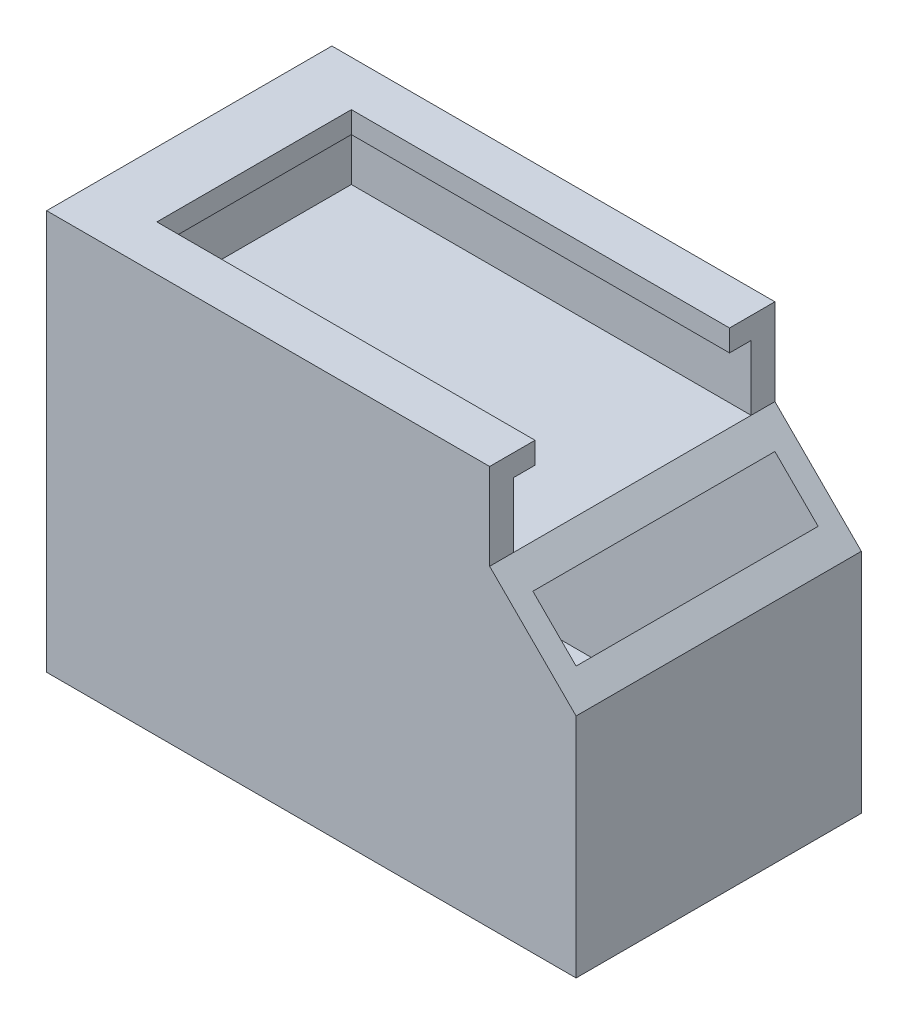
ISO-10303-21;
HEADER;
FILE_DESCRIPTION(('STEP AP214'),'2;1');
FILE_NAME('part.step','',(''),(''),'','','');
FILE_SCHEMA(('AUTOMOTIVE_DESIGN { 1 0 10303 214 1 1 1 1 }'));
ENDSEC;
DATA;
#1=APPLICATION_CONTEXT('core data for automotive mechanical design processes');
#2=APPLICATION_PROTOCOL_DEFINITION('international standard','automotive_design',2000,#1);
#3=PRODUCT_CONTEXT('',#1,'mechanical');
#4=PRODUCT('Part','Part','',(#3));
#5=PRODUCT_RELATED_PRODUCT_CATEGORY('part','',(#4));
#6=PRODUCT_DEFINITION_FORMATION('','',#4);
#7=PRODUCT_DEFINITION_CONTEXT('part definition',#1,'design');
#8=PRODUCT_DEFINITION('design','',#6,#7);
#9=PRODUCT_DEFINITION_SHAPE('','',#8);
#10=(LENGTH_UNIT() NAMED_UNIT(*) SI_UNIT(.MILLI.,.METRE.));
#11=(NAMED_UNIT(*) PLANE_ANGLE_UNIT() SI_UNIT($,.RADIAN.));
#12=(NAMED_UNIT(*) SI_UNIT($,.STERADIAN.) SOLID_ANGLE_UNIT());
#13=UNCERTAINTY_MEASURE_WITH_UNIT(LENGTH_MEASURE(1.E-05),#10,'distance_accuracy_value','');
#14=(GEOMETRIC_REPRESENTATION_CONTEXT(3) GLOBAL_UNCERTAINTY_ASSIGNED_CONTEXT((#13)) GLOBAL_UNIT_ASSIGNED_CONTEXT((#10,
#11,#12)) REPRESENTATION_CONTEXT('',''));
#15=CARTESIAN_POINT('',(0.,0.,0.));
#16=DIRECTION('',(0.,0.,1.));
#17=DIRECTION('',(1.,0.,0.));
#18=AXIS2_PLACEMENT_3D('',#15,#16,#17);
#19=CARTESIAN_POINT('',(0.,34.29,28.448));
#20=DIRECTION('',(0.,-1.,0.));
#21=DIRECTION('',(0.,0.,-1.));
#22=AXIS2_PLACEMENT_3D('',#19,#20,#21);
#23=PLANE('',#22);
#24=DIRECTION('',(-1.,0.,0.));
#25=VECTOR('',#24,1.);
#26=CARTESIAN_POINT('',(49.53,34.29,28.194));
#27=LINE('',#26,#25);
#28=CARTESIAN_POINT('',(49.53,34.29,28.194));
#29=VERTEX_POINT('',#28);
#30=CARTESIAN_POINT('',(2.54,34.29,28.194));
#31=VERTEX_POINT('',#30);
#32=EDGE_CURVE('E56',#29,#31,#27,.T.);
#33=ORIENTED_EDGE('',*,*,#32,.F.);
#34=DIRECTION('',(0.,0.,1.));
#35=VECTOR('',#34,1.);
#36=CARTESIAN_POINT('',(49.53,34.29,-2.54));
#37=LINE('',#36,#35);
#38=CARTESIAN_POINT('',(49.53,34.29,0.253999999999999));
#39=VERTEX_POINT('',#38);
#40=EDGE_CURVE('E311',#39,#29,#37,.T.);
#41=ORIENTED_EDGE('',*,*,#40,.F.);
#42=DIRECTION('',(1.,0.,0.));
#43=VECTOR('',#42,1.);
#44=CARTESIAN_POINT('',(2.54,34.29,0.254000000000001));
#45=LINE('',#44,#43);
#46=CARTESIAN_POINT('',(2.54,34.29,0.254000000000001));
#47=VERTEX_POINT('',#46);
#48=EDGE_CURVE('E554',#47,#39,#45,.T.);
#49=ORIENTED_EDGE('',*,*,#48,.F.);
#50=DIRECTION('',(0.,0.,-1.));
#51=VECTOR('',#50,1.);
#52=CARTESIAN_POINT('',(2.54,34.29,28.194));
#53=LINE('',#52,#51);
#54=EDGE_CURVE('E51',#31,#47,#53,.T.);
#55=ORIENTED_EDGE('',*,*,#54,.F.);
#56=EDGE_LOOP('',(#33,#41,#49,#55));
#57=FACE_BOUND('',#56,.T.);
#58=ADVANCED_FACE('F34',(#57),#23,.F.);
#59=CARTESIAN_POINT('',(0.,0.,28.448));
#60=DIRECTION('',(1.,0.,0.));
#61=DIRECTION('',(0.,0.,-1.));
#62=AXIS2_PLACEMENT_3D('',#59,#60,#61);
#63=PLANE('',#62);
#64=DIRECTION('',(0.,-1.,0.));
#65=VECTOR('',#64,1.);
#66=CARTESIAN_POINT('',(0.,0.,0.));
#67=LINE('',#66,#65);
#68=CARTESIAN_POINT('',(0.,31.75,0.));
#69=VERTEX_POINT('',#68);
#70=CARTESIAN_POINT('',(0.,0.,0.));
#71=VERTEX_POINT('',#70);
#72=EDGE_CURVE('E270',#69,#71,#67,.T.);
#73=ORIENTED_EDGE('',*,*,#72,.F.);
#74=DIRECTION('',(0.,0.,-1.));
#75=VECTOR('',#74,1.);
#76=CARTESIAN_POINT('',(0.,31.75,28.448));
#77=LINE('',#76,#75);
#78=CARTESIAN_POINT('',(0.,31.75,28.448));
#79=VERTEX_POINT('',#78);
#80=EDGE_CURVE('E306',#79,#69,#77,.T.);
#81=ORIENTED_EDGE('',*,*,#80,.F.);
#82=DIRECTION('',(0.,-1.,0.));
#83=VECTOR('',#82,1.);
#84=CARTESIAN_POINT('',(0.,0.,28.448));
#85=LINE('',#84,#83);
#86=CARTESIAN_POINT('',(0.,0.,28.448));
#87=VERTEX_POINT('',#86);
#88=EDGE_CURVE('E290',#79,#87,#85,.T.);
#89=ORIENTED_EDGE('',*,*,#88,.T.);
#90=DIRECTION('',(0.,0.,-1.));
#91=VECTOR('',#90,1.);
#92=CARTESIAN_POINT('',(0.,0.,28.448));
#93=LINE('',#92,#91);
#94=EDGE_CURVE('E301',#87,#71,#93,.T.);
#95=ORIENTED_EDGE('',*,*,#94,.T.);
#96=EDGE_LOOP('',(#73,#81,#89,#95));
#97=FACE_BOUND('',#96,.T.);
#98=ADVANCED_FACE('F345',(#97),#63,.T.);
#99=CARTESIAN_POINT('',(0.,0.,28.448));
#100=DIRECTION('',(0.,1.,0.));
#101=DIRECTION('',(0.,0.,1.));
#102=AXIS2_PLACEMENT_3D('',#99,#100,#101);
#103=PLANE('',#102);
#104=DIRECTION('',(1.,0.,0.));
#105=VECTOR('',#104,1.);
#106=CARTESIAN_POINT('',(0.,0.,0.));
#107=LINE('',#106,#105);
#108=CARTESIAN_POINT('',(57.15,0.,0.));
#109=VERTEX_POINT('',#108);
#110=EDGE_CURVE('E304',#71,#109,#107,.T.);
#111=ORIENTED_EDGE('',*,*,#110,.F.);
#112=ORIENTED_EDGE('',*,*,#94,.F.);
#113=DIRECTION('',(1.,0.,0.));
#114=VECTOR('',#113,1.);
#115=CARTESIAN_POINT('',(0.,0.,28.448));
#116=LINE('',#115,#114);
#117=CARTESIAN_POINT('',(57.15,0.,28.448));
#118=VERTEX_POINT('',#117);
#119=EDGE_CURVE('E288',#87,#118,#116,.T.);
#120=ORIENTED_EDGE('',*,*,#119,.T.);
#121=DIRECTION('',(0.,0.,-1.));
#122=VECTOR('',#121,1.);
#123=CARTESIAN_POINT('',(57.15,0.,28.448));
#124=LINE('',#123,#122);
#125=EDGE_CURVE('E295',#118,#109,#124,.T.);
#126=ORIENTED_EDGE('',*,*,#125,.T.);
#127=EDGE_LOOP('',(#111,#112,#120,#126));
#128=FACE_BOUND('',#127,.T.);
#129=ADVANCED_FACE('F340',(#128),#103,.T.);
#130=CARTESIAN_POINT('',(57.15,0.,28.448));
#131=DIRECTION('',(-1.,0.,0.));
#132=DIRECTION('',(0.,0.,1.));
#133=AXIS2_PLACEMENT_3D('',#130,#131,#132);
#134=PLANE('',#133);
#135=DIRECTION('',(0.,0.,1.));
#136=VECTOR('',#135,1.);
#137=CARTESIAN_POINT('',(57.15,26.6700000000001,28.448));
#138=LINE('',#137,#136);
#139=CARTESIAN_POINT('',(57.15,26.6700000000001,0.));
#140=VERTEX_POINT('',#139);
#141=CARTESIAN_POINT('',(57.15,26.6700000000001,28.448));
#142=VERTEX_POINT('',#141);
#143=EDGE_CURVE('E264',#140,#142,#138,.T.);
#144=ORIENTED_EDGE('',*,*,#143,.F.);
#145=DIRECTION('',(0.,1.,0.));
#146=VECTOR('',#145,1.);
#147=CARTESIAN_POINT('',(57.15,0.,0.));
#148=LINE('',#147,#146);
#149=EDGE_CURVE('E298',#109,#140,#148,.T.);
#150=ORIENTED_EDGE('',*,*,#149,.F.);
#151=ORIENTED_EDGE('',*,*,#125,.F.);
#152=DIRECTION('',(0.,1.,0.));
#153=VECTOR('',#152,1.);
#154=CARTESIAN_POINT('',(57.15,0.,28.448));
#155=LINE('',#154,#153);
#156=EDGE_CURVE('E285',#118,#142,#155,.T.);
#157=ORIENTED_EDGE('',*,*,#156,.T.);
#158=EDGE_LOOP('',(#144,#150,#151,#157));
#159=FACE_BOUND('',#158,.T.);
#160=ADVANCED_FACE('F338',(#159),#134,.T.);
#161=CARTESIAN_POINT('',(0.,31.75,28.448));
#162=DIRECTION('',(0.,-1.,0.));
#163=DIRECTION('',(0.,0.,-1.));
#164=AXIS2_PLACEMENT_3D('',#161,#162,#163);
#165=PLANE('',#164);
#166=DIRECTION('',(0.,0.,-1.));
#167=VECTOR('',#166,1.);
#168=CARTESIAN_POINT('',(52.07,31.75,28.448));
#169=LINE('',#168,#167);
#170=CARTESIAN_POINT('',(52.07,31.75,28.448));
#171=VERTEX_POINT('',#170);
#172=CARTESIAN_POINT('',(52.07,31.75,0.));
#173=VERTEX_POINT('',#172);
#174=EDGE_CURVE('E322',#171,#173,#169,.T.);
#175=ORIENTED_EDGE('',*,*,#174,.F.);
#176=DIRECTION('',(-1.,0.,0.));
#177=VECTOR('',#176,1.);
#178=CARTESIAN_POINT('',(0.,31.75,28.448));
#179=LINE('',#178,#177);
#180=EDGE_CURVE('E43',#171,#79,#179,.T.);
#181=ORIENTED_EDGE('',*,*,#180,.T.);
#182=ORIENTED_EDGE('',*,*,#80,.T.);
#183=DIRECTION('',(-1.,0.,0.));
#184=VECTOR('',#183,1.);
#185=CARTESIAN_POINT('',(0.,31.75,0.));
#186=LINE('',#185,#184);
#187=EDGE_CURVE('E293',#173,#69,#186,.T.);
#188=ORIENTED_EDGE('',*,*,#187,.F.);
#189=EDGE_LOOP('',(#175,#181,#182,#188));
#190=FACE_BOUND('',#189,.T.);
#191=ADVANCED_FACE('F348',(#190),#165,.T.);
#192=CARTESIAN_POINT('',(0.,0.,28.448));
#193=DIRECTION('',(0.,0.,-1.));
#194=DIRECTION('',(-1.,0.,0.));
#195=AXIS2_PLACEMENT_3D('',#192,#193,#194);
#196=PLANE('',#195);
#197=DIRECTION('',(-0.707106781186551,0.707106781186544,0.));
#198=VECTOR('',#197,1.);
#199=CARTESIAN_POINT('',(41.9099999999998,41.9100000000002,28.448));
#200=LINE('',#199,#198);
#201=EDGE_CURVE('E260',#142,#171,#200,.T.);
#202=ORIENTED_EDGE('',*,*,#201,.F.);
#203=ORIENTED_EDGE('',*,*,#156,.F.);
#204=ORIENTED_EDGE('',*,*,#119,.F.);
#205=ORIENTED_EDGE('',*,*,#88,.F.);
#206=ORIENTED_EDGE('',*,*,#180,.F.);
#207=EDGE_LOOP('',(#202,#203,#204,#205,#206));
#208=FACE_BOUND('',#207,.T.);
#209=ADVANCED_FACE('F335',(#208),#196,.T.);
#210=CARTESIAN_POINT('',(0.,0.,0.));
#211=DIRECTION('',(0.,0.,-1.));
#212=DIRECTION('',(-1.,0.,0.));
#213=AXIS2_PLACEMENT_3D('',#210,#211,#212);
#214=PLANE('',#213);
#215=ORIENTED_EDGE('',*,*,#149,.T.);
#216=DIRECTION('',(-0.707106781186551,0.707106781186544,0.));
#217=VECTOR('',#216,1.);
#218=CARTESIAN_POINT('',(41.9099999999998,41.9100000000002,0.));
#219=LINE('',#218,#217);
#220=EDGE_CURVE('E11',#140,#173,#219,.T.);
#221=ORIENTED_EDGE('',*,*,#220,.T.);
#222=ORIENTED_EDGE('',*,*,#187,.T.);
#223=ORIENTED_EDGE('',*,*,#72,.T.);
#224=ORIENTED_EDGE('',*,*,#110,.T.);
#225=EDGE_LOOP('',(#215,#221,#222,#223,#224));
#226=FACE_BOUND('',#225,.T.);
#227=ADVANCED_FACE('F36',(#226),#214,.F.);
#228=CARTESIAN_POINT('',(49.53,34.29,-2.54));
#229=DIRECTION('',(-0.707106781186544,-0.707106781186551,0.));
#230=DIRECTION('',(0.707106781186551,-0.707106781186544,0.));
#231=AXIS2_PLACEMENT_3D('',#228,#229,#230);
#232=PLANE('',#231);
#233=ORIENTED_EDGE('',*,*,#201,.T.);
#234=ORIENTED_EDGE('',*,*,#174,.T.);
#235=ORIENTED_EDGE('',*,*,#220,.F.);
#236=ORIENTED_EDGE('',*,*,#143,.T.);
#237=EDGE_LOOP('',(#233,#234,#235,#236));
#238=FACE_BOUND('',#237,.T.);
#239=DIRECTION('',(0.,0.,1.));
#240=VECTOR('',#239,1.);
#241=CARTESIAN_POINT('',(59.69,24.1300000000001,-2.54));
#242=LINE('',#241,#240);
#243=CARTESIAN_POINT('',(59.69,24.1300000000001,-2.54));
#244=VERTEX_POINT('',#243);
#245=CARTESIAN_POINT('',(59.69,24.1300000000001,30.988));
#246=VERTEX_POINT('',#245);
#247=EDGE_CURVE('E320',#244,#246,#242,.T.);
#248=ORIENTED_EDGE('',*,*,#247,.F.);
#249=DIRECTION('',(0.707106781186551,-0.707106781186544,0.));
#250=VECTOR('',#249,1.);
#251=CARTESIAN_POINT('',(49.53,34.29,-2.54));
#252=LINE('',#251,#250);
#253=CARTESIAN_POINT('',(49.53,34.29,-2.54));
#254=VERTEX_POINT('',#253);
#255=EDGE_CURVE('E315',#254,#244,#252,.T.);
#256=ORIENTED_EDGE('',*,*,#255,.F.);
#257=EDGE_CURVE('E314',#254,#39,#37,.T.);
#258=ORIENTED_EDGE('',*,*,#257,.T.);
#259=ORIENTED_EDGE('',*,*,#40,.T.);
#260=DIRECTION('',(0.,0.,1.));
#261=VECTOR('',#260,1.);
#262=CARTESIAN_POINT('',(49.53,34.29,28.194));
#263=LINE('',#262,#261);
#264=CARTESIAN_POINT('',(49.53,34.29,30.988));
#265=VERTEX_POINT('',#264);
#266=EDGE_CURVE('E558',#29,#265,#263,.T.);
#267=ORIENTED_EDGE('',*,*,#266,.T.);
#268=DIRECTION('',(0.707106781186551,-0.707106781186544,0.));
#269=VECTOR('',#268,1.);
#270=CARTESIAN_POINT('',(49.53,34.29,30.988));
#271=LINE('',#270,#269);
#272=EDGE_CURVE('E538',#265,#246,#271,.T.);
#273=ORIENTED_EDGE('',*,*,#272,.T.);
#274=EDGE_LOOP('',(#248,#256,#258,#259,#267,#273));
#275=FACE_BOUND('',#274,.T.);
#276=ADVANCED_FACE('F327',(#238,#275),#232,.F.);
#277=CARTESIAN_POINT('',(-2.54,0.,28.448));
#278=DIRECTION('',(1.,0.,0.));
#279=DIRECTION('',(0.,0.,-1.));
#280=AXIS2_PLACEMENT_3D('',#277,#278,#279);
#281=PLANE('',#280);
#282=DIRECTION('',(0.,-1.,0.));
#283=VECTOR('',#282,1.);
#284=CARTESIAN_POINT('',(-2.54,0.,-2.54));
#285=LINE('',#284,#283);
#286=CARTESIAN_POINT('',(-2.54,44.45,-2.54));
#287=VERTEX_POINT('',#286);
#288=CARTESIAN_POINT('',(-2.54,-2.54,-2.54));
#289=VERTEX_POINT('',#288);
#290=EDGE_CURVE('E254',#287,#289,#285,.T.);
#291=ORIENTED_EDGE('',*,*,#290,.T.);
#292=DIRECTION('',(0.,0.,-1.));
#293=VECTOR('',#292,1.);
#294=CARTESIAN_POINT('',(-2.54,-2.54,28.448));
#295=LINE('',#294,#293);
#296=CARTESIAN_POINT('',(-2.54,-2.54,30.988));
#297=VERTEX_POINT('',#296);
#298=EDGE_CURVE('E268',#297,#289,#295,.T.);
#299=ORIENTED_EDGE('',*,*,#298,.F.);
#300=DIRECTION('',(0.,-1.,0.));
#301=VECTOR('',#300,1.);
#302=CARTESIAN_POINT('',(-2.54,0.,30.988));
#303=LINE('',#302,#301);
#304=CARTESIAN_POINT('',(-2.54,44.45,30.988));
#305=VERTEX_POINT('',#304);
#306=EDGE_CURVE('E272',#305,#297,#303,.T.);
#307=ORIENTED_EDGE('',*,*,#306,.F.);
#308=DIRECTION('',(0.,0.,1.));
#309=VECTOR('',#308,1.);
#310=CARTESIAN_POINT('',(-2.54,44.45,-2.54));
#311=LINE('',#310,#309);
#312=EDGE_CURVE('E204',#287,#305,#311,.T.);
#313=ORIENTED_EDGE('',*,*,#312,.F.);
#314=EDGE_LOOP('',(#291,#299,#307,#313));
#315=FACE_BOUND('',#314,.T.);
#316=ADVANCED_FACE('F355',(#315),#281,.F.);
#317=CARTESIAN_POINT('',(0.,-2.54,28.448));
#318=DIRECTION('',(0.,1.,0.));
#319=DIRECTION('',(0.,0.,1.));
#320=AXIS2_PLACEMENT_3D('',#317,#318,#319);
#321=PLANE('',#320);
#322=DIRECTION('',(1.,0.,0.));
#323=VECTOR('',#322,1.);
#324=CARTESIAN_POINT('',(0.,-2.54,-2.54));
#325=LINE('',#324,#323);
#326=CARTESIAN_POINT('',(59.69,-2.54,-2.54));
#327=VERTEX_POINT('',#326);
#328=EDGE_CURVE('E256',#289,#327,#325,.T.);
#329=ORIENTED_EDGE('',*,*,#328,.T.);
#330=DIRECTION('',(0.,0.,-1.));
#331=VECTOR('',#330,1.);
#332=CARTESIAN_POINT('',(59.69,-2.54,28.448));
#333=LINE('',#332,#331);
#334=CARTESIAN_POINT('',(59.69,-2.54,30.988));
#335=VERTEX_POINT('',#334);
#336=EDGE_CURVE('E271',#335,#327,#333,.T.);
#337=ORIENTED_EDGE('',*,*,#336,.F.);
#338=DIRECTION('',(1.,0.,0.));
#339=VECTOR('',#338,1.);
#340=CARTESIAN_POINT('',(0.,-2.54,30.988));
#341=LINE('',#340,#339);
#342=EDGE_CURVE('E274',#297,#335,#341,.T.);
#343=ORIENTED_EDGE('',*,*,#342,.F.);
#344=ORIENTED_EDGE('',*,*,#298,.T.);
#345=EDGE_LOOP('',(#329,#337,#343,#344));
#346=FACE_BOUND('',#345,.T.);
#347=ADVANCED_FACE('F400',(#346),#321,.F.);
#348=CARTESIAN_POINT('',(59.69,0.,28.448));
#349=DIRECTION('',(-1.,0.,0.));
#350=DIRECTION('',(0.,0.,1.));
#351=AXIS2_PLACEMENT_3D('',#348,#349,#350);
#352=PLANE('',#351);
#353=DIRECTION('',(0.,1.,0.));
#354=VECTOR('',#353,1.);
#355=CARTESIAN_POINT('',(59.69,0.,-2.54));
#356=LINE('',#355,#354);
#357=EDGE_CURVE('E262',#327,#244,#356,.T.);
#358=ORIENTED_EDGE('',*,*,#357,.T.);
#359=ORIENTED_EDGE('',*,*,#247,.T.);
#360=DIRECTION('',(0.,1.,0.));
#361=VECTOR('',#360,1.);
#362=CARTESIAN_POINT('',(59.69,0.,30.988));
#363=LINE('',#362,#361);
#364=EDGE_CURVE('E278',#335,#246,#363,.T.);
#365=ORIENTED_EDGE('',*,*,#364,.F.);
#366=ORIENTED_EDGE('',*,*,#336,.T.);
#367=EDGE_LOOP('',(#358,#359,#365,#366));
#368=FACE_BOUND('',#367,.T.);
#369=ADVANCED_FACE('F365',(#368),#352,.F.);
#370=CARTESIAN_POINT('',(0.,0.,30.988));
#371=DIRECTION('',(0.,0.,-1.));
#372=DIRECTION('',(-1.,0.,0.));
#373=AXIS2_PLACEMENT_3D('',#370,#371,#372);
#374=PLANE('',#373);
#375=ORIENTED_EDGE('',*,*,#364,.T.);
#376=ORIENTED_EDGE('',*,*,#272,.F.);
#377=DIRECTION('',(0.,-1.,0.));
#378=VECTOR('',#377,1.);
#379=CARTESIAN_POINT('',(49.53,41.91,30.988));
#380=LINE('',#379,#378);
#381=CARTESIAN_POINT('',(49.53,44.45,30.988));
#382=VERTEX_POINT('',#381);
#383=EDGE_CURVE('E548',#382,#265,#380,.T.);
#384=ORIENTED_EDGE('',*,*,#383,.F.);
#385=DIRECTION('',(1.,0.,0.));
#386=VECTOR('',#385,1.);
#387=CARTESIAN_POINT('',(-2.54,44.45,30.988));
#388=LINE('',#387,#386);
#389=EDGE_CURVE('E174',#305,#382,#388,.T.);
#390=ORIENTED_EDGE('',*,*,#389,.F.);
#391=ORIENTED_EDGE('',*,*,#306,.T.);
#392=ORIENTED_EDGE('',*,*,#342,.T.);
#393=EDGE_LOOP('',(#375,#376,#384,#390,#391,#392));
#394=FACE_BOUND('',#393,.T.);
#395=ADVANCED_FACE('F367',(#394),#374,.F.);
#396=CARTESIAN_POINT('',(0.,0.,-2.54));
#397=DIRECTION('',(0.,0.,-1.));
#398=DIRECTION('',(-1.,0.,0.));
#399=AXIS2_PLACEMENT_3D('',#396,#397,#398);
#400=PLANE('',#399);
#401=ORIENTED_EDGE('',*,*,#255,.T.);
#402=ORIENTED_EDGE('',*,*,#357,.F.);
#403=ORIENTED_EDGE('',*,*,#328,.F.);
#404=ORIENTED_EDGE('',*,*,#290,.F.);
#405=DIRECTION('',(-1.,0.,0.));
#406=VECTOR('',#405,1.);
#407=CARTESIAN_POINT('',(49.53,44.45,-2.54));
#408=LINE('',#407,#406);
#409=CARTESIAN_POINT('',(49.53,44.45,-2.54));
#410=VERTEX_POINT('',#409);
#411=EDGE_CURVE('E201',#410,#287,#408,.T.);
#412=ORIENTED_EDGE('',*,*,#411,.F.);
#413=DIRECTION('',(0.,-1.,0.));
#414=VECTOR('',#413,1.);
#415=CARTESIAN_POINT('',(49.53,41.91,-2.54));
#416=LINE('',#415,#414);
#417=EDGE_CURVE('E247',#410,#254,#416,.T.);
#418=ORIENTED_EDGE('',*,*,#417,.T.);
#419=EDGE_LOOP('',(#401,#402,#403,#404,#412,#418));
#420=FACE_BOUND('',#419,.T.);
#421=ADVANCED_FACE('F252',(#420),#400,.T.);
#422=CARTESIAN_POINT('',(49.53,41.91,28.194));
#423=DIRECTION('',(0.,0.,1.));
#424=DIRECTION('',(1.,0.,0.));
#425=AXIS2_PLACEMENT_3D('',#422,#423,#424);
#426=PLANE('',#425);
#427=ORIENTED_EDGE('',*,*,#32,.T.);
#428=DIRECTION('',(0.,-1.,0.));
#429=VECTOR('',#428,1.);
#430=CARTESIAN_POINT('',(2.54,41.91,28.194));
#431=LINE('',#430,#429);
#432=CARTESIAN_POINT('',(2.54,41.91,28.194));
#433=VERTEX_POINT('',#432);
#434=EDGE_CURVE('E539',#433,#31,#431,.T.);
#435=ORIENTED_EDGE('',*,*,#434,.F.);
#436=DIRECTION('',(-1.,0.,0.));
#437=VECTOR('',#436,1.);
#438=CARTESIAN_POINT('',(49.53,41.91,28.194));
#439=LINE('',#438,#437);
#440=CARTESIAN_POINT('',(49.53,41.91,28.194));
#441=VERTEX_POINT('',#440);
#442=EDGE_CURVE('E566',#441,#433,#439,.T.);
#443=ORIENTED_EDGE('',*,*,#442,.F.);
#444=DIRECTION('',(0.,-1.,0.));
#445=VECTOR('',#444,1.);
#446=CARTESIAN_POINT('',(49.53,41.91,28.194));
#447=LINE('',#446,#445);
#448=EDGE_CURVE('E550',#441,#29,#447,.T.);
#449=ORIENTED_EDGE('',*,*,#448,.T.);
#450=EDGE_LOOP('',(#427,#435,#443,#449));
#451=FACE_BOUND('',#450,.T.);
#452=ADVANCED_FACE('F372',(#451),#426,.F.);
#453=CARTESIAN_POINT('',(2.54,41.91,28.194));
#454=DIRECTION('',(-1.,0.,0.));
#455=DIRECTION('',(0.,0.,1.));
#456=AXIS2_PLACEMENT_3D('',#453,#454,#455);
#457=PLANE('',#456);
#458=ORIENTED_EDGE('',*,*,#54,.T.);
#459=DIRECTION('',(0.,-1.,0.));
#460=VECTOR('',#459,1.);
#461=CARTESIAN_POINT('',(2.54,41.91,0.254000000000001));
#462=LINE('',#461,#460);
#463=CARTESIAN_POINT('',(2.54,41.91,0.254000000000001));
#464=VERTEX_POINT('',#463);
#465=EDGE_CURVE('E543',#464,#47,#462,.T.);
#466=ORIENTED_EDGE('',*,*,#465,.F.);
#467=DIRECTION('',(0.,0.,-1.));
#468=VECTOR('',#467,1.);
#469=CARTESIAN_POINT('',(2.54,41.91,28.194));
#470=LINE('',#469,#468);
#471=EDGE_CURVE('E219',#433,#464,#470,.T.);
#472=ORIENTED_EDGE('',*,*,#471,.F.);
#473=ORIENTED_EDGE('',*,*,#434,.T.);
#474=EDGE_LOOP('',(#458,#466,#472,#473));
#475=FACE_BOUND('',#474,.T.);
#476=ADVANCED_FACE('F449',(#475),#457,.F.);
#477=CARTESIAN_POINT('',(2.54,41.91,0.254000000000001));
#478=DIRECTION('',(0.,0.,-1.));
#479=DIRECTION('',(-1.,0.,0.));
#480=AXIS2_PLACEMENT_3D('',#477,#478,#479);
#481=PLANE('',#480);
#482=ORIENTED_EDGE('',*,*,#48,.T.);
#483=DIRECTION('',(0.,-1.,0.));
#484=VECTOR('',#483,1.);
#485=CARTESIAN_POINT('',(49.53,41.91,0.253999999999997));
#486=LINE('',#485,#484);
#487=CARTESIAN_POINT('',(49.53,41.91,0.253999999999999));
#488=VERTEX_POINT('',#487);
#489=EDGE_CURVE('E546',#488,#39,#486,.T.);
#490=ORIENTED_EDGE('',*,*,#489,.F.);
#491=DIRECTION('',(1.,0.,0.));
#492=VECTOR('',#491,1.);
#493=CARTESIAN_POINT('',(2.54,41.91,0.254000000000001));
#494=LINE('',#493,#492);
#495=EDGE_CURVE('E564',#464,#488,#494,.T.);
#496=ORIENTED_EDGE('',*,*,#495,.F.);
#497=ORIENTED_EDGE('',*,*,#465,.T.);
#498=EDGE_LOOP('',(#482,#490,#496,#497));
#499=FACE_BOUND('',#498,.T.);
#500=ADVANCED_FACE('F459',(#499),#481,.F.);
#501=CARTESIAN_POINT('',(49.53,41.91,0.253999999999997));
#502=DIRECTION('',(-1.,0.,0.));
#503=DIRECTION('',(0.,0.,1.));
#504=AXIS2_PLACEMENT_3D('',#501,#502,#503);
#505=PLANE('',#504);
#506=ORIENTED_EDGE('',*,*,#257,.F.);
#507=ORIENTED_EDGE('',*,*,#417,.F.);
#508=DIRECTION('',(0.,0.,-1.));
#509=VECTOR('',#508,1.);
#510=CARTESIAN_POINT('',(49.53,44.45,2.794));
#511=LINE('',#510,#509);
#512=CARTESIAN_POINT('',(49.53,44.45,2.794));
#513=VERTEX_POINT('',#512);
#514=EDGE_CURVE('E198',#513,#410,#511,.T.);
#515=ORIENTED_EDGE('',*,*,#514,.F.);
#516=DIRECTION('',(0.,-1.,0.));
#517=VECTOR('',#516,1.);
#518=CARTESIAN_POINT('',(49.53,44.45,2.794));
#519=LINE('',#518,#517);
#520=CARTESIAN_POINT('',(49.53,41.91,2.794));
#521=VERTEX_POINT('',#520);
#522=EDGE_CURVE('E207',#513,#521,#519,.T.);
#523=ORIENTED_EDGE('',*,*,#522,.T.);
#524=DIRECTION('',(0.,0.,-1.));
#525=VECTOR('',#524,1.);
#526=CARTESIAN_POINT('',(49.53,41.91,0.253999999999997));
#527=LINE('',#526,#525);
#528=EDGE_CURVE('E177',#521,#488,#527,.T.);
#529=ORIENTED_EDGE('',*,*,#528,.T.);
#530=ORIENTED_EDGE('',*,*,#489,.T.);
#531=EDGE_LOOP('',(#506,#507,#515,#523,#529,#530));
#532=FACE_BOUND('',#531,.T.);
#533=ADVANCED_FACE('F244',(#532),#505,.F.);
#534=CARTESIAN_POINT('',(49.53,41.91,28.194));
#535=DIRECTION('',(1.,0.,0.));
#536=DIRECTION('',(0.,0.,-1.));
#537=AXIS2_PLACEMENT_3D('',#534,#535,#536);
#538=PLANE('',#537);
#539=ORIENTED_EDGE('',*,*,#266,.F.);
#540=ORIENTED_EDGE('',*,*,#448,.F.);
#541=DIRECTION('',(0.,0.,-1.));
#542=VECTOR('',#541,1.);
#543=CARTESIAN_POINT('',(49.53,41.91,28.194));
#544=LINE('',#543,#542);
#545=CARTESIAN_POINT('',(49.53,41.91,25.654));
#546=VERTEX_POINT('',#545);
#547=EDGE_CURVE('E184',#441,#546,#544,.T.);
#548=ORIENTED_EDGE('',*,*,#547,.T.);
#549=DIRECTION('',(0.,-1.,0.));
#550=VECTOR('',#549,1.);
#551=CARTESIAN_POINT('',(49.53,44.45,25.654));
#552=LINE('',#551,#550);
#553=CARTESIAN_POINT('',(49.53,44.45,25.654));
#554=VERTEX_POINT('',#553);
#555=EDGE_CURVE('E180',#554,#546,#552,.T.);
#556=ORIENTED_EDGE('',*,*,#555,.F.);
#557=DIRECTION('',(0.,0.,-1.));
#558=VECTOR('',#557,1.);
#559=CARTESIAN_POINT('',(49.53,44.45,30.988));
#560=LINE('',#559,#558);
#561=EDGE_CURVE('E166',#382,#554,#560,.T.);
#562=ORIENTED_EDGE('',*,*,#561,.F.);
#563=ORIENTED_EDGE('',*,*,#383,.T.);
#564=EDGE_LOOP('',(#539,#540,#548,#556,#562,#563));
#565=FACE_BOUND('',#564,.T.);
#566=ADVANCED_FACE('F182',(#565),#538,.T.);
#567=CARTESIAN_POINT('',(0.,41.91,0.));
#568=DIRECTION('',(0.,1.,0.));
#569=DIRECTION('',(0.,0.,1.));
#570=AXIS2_PLACEMENT_3D('',#567,#568,#569);
#571=PLANE('',#570);
#572=ORIENTED_EDGE('',*,*,#547,.F.);
#573=ORIENTED_EDGE('',*,*,#442,.T.);
#574=ORIENTED_EDGE('',*,*,#471,.T.);
#575=ORIENTED_EDGE('',*,*,#495,.T.);
#576=ORIENTED_EDGE('',*,*,#528,.F.);
#577=DIRECTION('',(1.,0.,0.));
#578=VECTOR('',#577,1.);
#579=CARTESIAN_POINT('',(5.08,41.91,2.794));
#580=LINE('',#579,#578);
#581=CARTESIAN_POINT('',(5.08,41.91,2.794));
#582=VERTEX_POINT('',#581);
#583=EDGE_CURVE('E218',#582,#521,#580,.T.);
#584=ORIENTED_EDGE('',*,*,#583,.F.);
#585=DIRECTION('',(0.,0.,-1.));
#586=VECTOR('',#585,1.);
#587=CARTESIAN_POINT('',(5.08,41.91,25.654));
#588=LINE('',#587,#586);
#589=CARTESIAN_POINT('',(5.08,41.91,25.654));
#590=VERTEX_POINT('',#589);
#591=EDGE_CURVE('E232',#590,#582,#588,.T.);
#592=ORIENTED_EDGE('',*,*,#591,.F.);
#593=DIRECTION('',(-1.,0.,0.));
#594=VECTOR('',#593,1.);
#595=CARTESIAN_POINT('',(49.53,41.91,25.654));
#596=LINE('',#595,#594);
#597=EDGE_CURVE('E210',#546,#590,#596,.T.);
#598=ORIENTED_EDGE('',*,*,#597,.F.);
#599=EDGE_LOOP('',(#572,#573,#574,#575,#576,#584,#592,#598));
#600=FACE_BOUND('',#599,.T.);
#601=ADVANCED_FACE('F235',(#600),#571,.F.);
#602=CARTESIAN_POINT('',(49.53,44.45,25.654));
#603=DIRECTION('',(0.,0.,1.));
#604=DIRECTION('',(1.,0.,0.));
#605=AXIS2_PLACEMENT_3D('',#602,#603,#604);
#606=PLANE('',#605);
#607=ORIENTED_EDGE('',*,*,#597,.T.);
#608=DIRECTION('',(0.,-1.,0.));
#609=VECTOR('',#608,1.);
#610=CARTESIAN_POINT('',(5.08,44.45,25.654));
#611=LINE('',#610,#609);
#612=CARTESIAN_POINT('',(5.08,44.45,25.654));
#613=VERTEX_POINT('',#612);
#614=EDGE_CURVE('E187',#613,#590,#611,.T.);
#615=ORIENTED_EDGE('',*,*,#614,.F.);
#616=DIRECTION('',(-1.,0.,0.));
#617=VECTOR('',#616,1.);
#618=CARTESIAN_POINT('',(49.53,44.45,25.654));
#619=LINE('',#618,#617);
#620=EDGE_CURVE('E170',#554,#613,#619,.T.);
#621=ORIENTED_EDGE('',*,*,#620,.F.);
#622=ORIENTED_EDGE('',*,*,#555,.T.);
#623=EDGE_LOOP('',(#607,#615,#621,#622));
#624=FACE_BOUND('',#623,.T.);
#625=ADVANCED_FACE('F189',(#624),#606,.F.);
#626=CARTESIAN_POINT('',(5.08,44.45,25.654));
#627=DIRECTION('',(-1.,0.,0.));
#628=DIRECTION('',(0.,0.,1.));
#629=AXIS2_PLACEMENT_3D('',#626,#627,#628);
#630=PLANE('',#629);
#631=ORIENTED_EDGE('',*,*,#591,.T.);
#632=DIRECTION('',(0.,-1.,0.));
#633=VECTOR('',#632,1.);
#634=CARTESIAN_POINT('',(5.08,44.45,2.794));
#635=LINE('',#634,#633);
#636=CARTESIAN_POINT('',(5.08,44.45,2.794));
#637=VERTEX_POINT('',#636);
#638=EDGE_CURVE('E226',#637,#582,#635,.T.);
#639=ORIENTED_EDGE('',*,*,#638,.F.);
#640=DIRECTION('',(0.,0.,-1.));
#641=VECTOR('',#640,1.);
#642=CARTESIAN_POINT('',(5.08,44.45,25.654));
#643=LINE('',#642,#641);
#644=EDGE_CURVE('E192',#613,#637,#643,.T.);
#645=ORIENTED_EDGE('',*,*,#644,.F.);
#646=ORIENTED_EDGE('',*,*,#614,.T.);
#647=EDGE_LOOP('',(#631,#639,#645,#646));
#648=FACE_BOUND('',#647,.T.);
#649=ADVANCED_FACE('F230',(#648),#630,.F.);
#650=CARTESIAN_POINT('',(5.08,44.45,2.794));
#651=DIRECTION('',(0.,0.,-1.));
#652=DIRECTION('',(-1.,0.,0.));
#653=AXIS2_PLACEMENT_3D('',#650,#651,#652);
#654=PLANE('',#653);
#655=ORIENTED_EDGE('',*,*,#583,.T.);
#656=ORIENTED_EDGE('',*,*,#522,.F.);
#657=DIRECTION('',(1.,0.,0.));
#658=VECTOR('',#657,1.);
#659=CARTESIAN_POINT('',(5.08,44.45,2.794));
#660=LINE('',#659,#658);
#661=EDGE_CURVE('E194',#637,#513,#660,.T.);
#662=ORIENTED_EDGE('',*,*,#661,.F.);
#663=ORIENTED_EDGE('',*,*,#638,.T.);
#664=EDGE_LOOP('',(#655,#656,#662,#663));
#665=FACE_BOUND('',#664,.T.);
#666=ADVANCED_FACE('F239',(#665),#654,.F.);
#667=CARTESIAN_POINT('',(0.,44.45,0.));
#668=DIRECTION('',(0.,1.,0.));
#669=DIRECTION('',(0.,0.,1.));
#670=AXIS2_PLACEMENT_3D('',#667,#668,#669);
#671=PLANE('',#670);
#672=ORIENTED_EDGE('',*,*,#561,.T.);
#673=ORIENTED_EDGE('',*,*,#620,.T.);
#674=ORIENTED_EDGE('',*,*,#644,.T.);
#675=ORIENTED_EDGE('',*,*,#661,.T.);
#676=ORIENTED_EDGE('',*,*,#514,.T.);
#677=ORIENTED_EDGE('',*,*,#411,.T.);
#678=ORIENTED_EDGE('',*,*,#312,.T.);
#679=ORIENTED_EDGE('',*,*,#389,.T.);
#680=EDGE_LOOP('',(#672,#673,#674,#675,#676,#677,#678,#679));
#681=FACE_BOUND('',#680,.T.);
#682=ADVANCED_FACE('F168',(#681),#671,.T.);
#683=CLOSED_SHELL('',(#58,#98,#129,#160,#191,#209,#227,#276,#316,#347,#369,#395,#421,#452,#476,
#500,#533,#566,#601,#625,#649,#666,#682));
#684=MANIFOLD_SOLID_BREP('B2',#683);
#685=ADVANCED_BREP_SHAPE_REPRESENTATION('',(#18,#684),#14);
#686=SHAPE_DEFINITION_REPRESENTATION(#9,#685);
ENDSEC;
END-ISO-10303-21;
